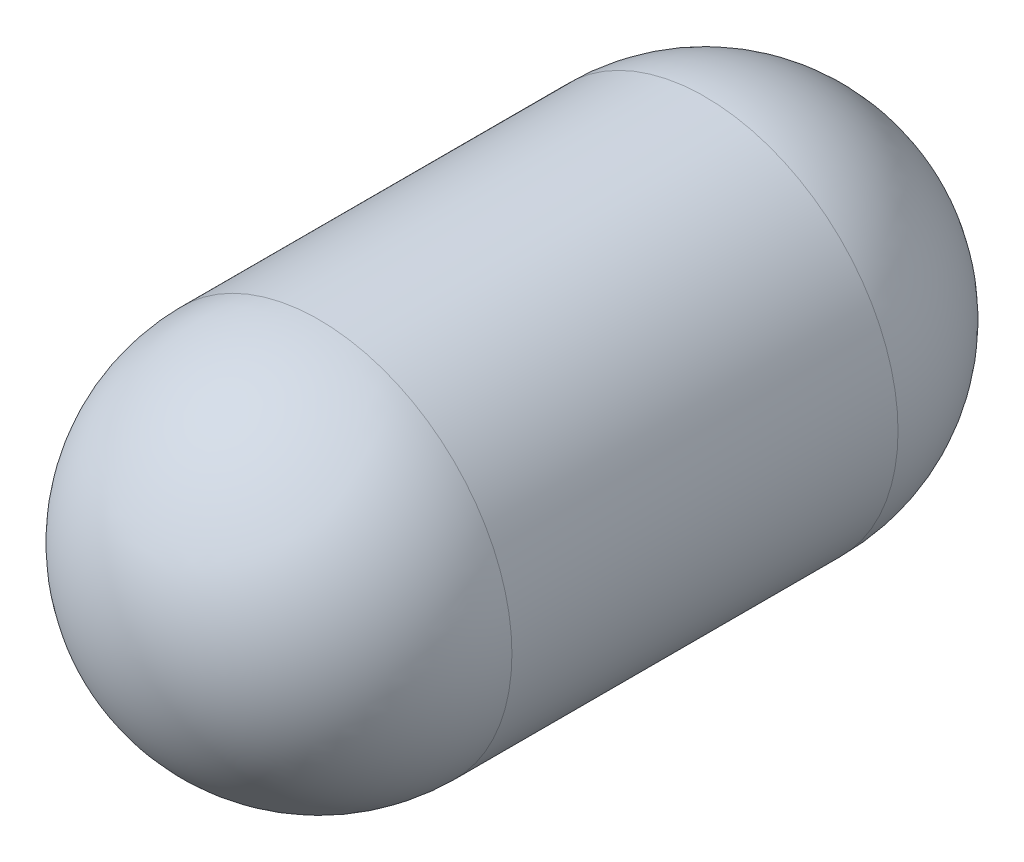
ISO-10303-21;
HEADER;
FILE_DESCRIPTION(('STEP AP214'),'2;1');
FILE_NAME('part.step','',(''),(''),'','','');
FILE_SCHEMA(('AUTOMOTIVE_DESIGN { 1 0 10303 214 1 1 1 1 }'));
ENDSEC;
DATA;
#1=APPLICATION_CONTEXT('core data for automotive mechanical design processes');
#2=APPLICATION_PROTOCOL_DEFINITION('international standard','automotive_design',2000,#1);
#3=PRODUCT_CONTEXT('',#1,'mechanical');
#4=PRODUCT('Part','Part','',(#3));
#5=PRODUCT_RELATED_PRODUCT_CATEGORY('part','',(#4));
#6=PRODUCT_DEFINITION_FORMATION('','',#4);
#7=PRODUCT_DEFINITION_CONTEXT('part definition',#1,'design');
#8=PRODUCT_DEFINITION('design','',#6,#7);
#9=PRODUCT_DEFINITION_SHAPE('','',#8);
#10=(LENGTH_UNIT() NAMED_UNIT(*) SI_UNIT(.MILLI.,.METRE.));
#11=(NAMED_UNIT(*) PLANE_ANGLE_UNIT() SI_UNIT($,.RADIAN.));
#12=(NAMED_UNIT(*) SI_UNIT($,.STERADIAN.) SOLID_ANGLE_UNIT());
#13=UNCERTAINTY_MEASURE_WITH_UNIT(LENGTH_MEASURE(1.E-05),#10,'distance_accuracy_value','');
#14=(GEOMETRIC_REPRESENTATION_CONTEXT(3) GLOBAL_UNCERTAINTY_ASSIGNED_CONTEXT((#13)) GLOBAL_UNIT_ASSIGNED_CONTEXT((#10,
#11,#12)) REPRESENTATION_CONTEXT('',''));
#15=CARTESIAN_POINT('',(0.,0.,0.));
#16=DIRECTION('',(0.,0.,1.));
#17=DIRECTION('',(1.,0.,0.));
#18=AXIS2_PLACEMENT_3D('',#15,#16,#17);
#19=CARTESIAN_POINT('',(0.,0.,-0.5));
#20=DIRECTION('',(0.,0.,1.));
#21=DIRECTION('',(1.,0.,0.));
#22=AXIS2_PLACEMENT_3D('',#19,#20,#21);
#23=CYLINDRICAL_SURFACE('',#22,0.5);
#24=CARTESIAN_POINT('',(0.,0.,-0.5));
#25=DIRECTION('',(0.,0.,1.));
#26=DIRECTION('',(1.,0.,0.));
#27=AXIS2_PLACEMENT_3D('',#24,#25,#26);
#28=CIRCLE('',#27,0.5);
#29=CARTESIAN_POINT('',(0.5,0.,-0.5));
#30=VERTEX_POINT('',#29);
#31=EDGE_CURVE('E10',#30,#30,#28,.T.);
#32=ORIENTED_EDGE('',*,*,#31,.T.);
#33=EDGE_LOOP('',(#32));
#34=FACE_BOUND('',#33,.T.);
#35=CARTESIAN_POINT('',(0.,0.,0.5));
#36=DIRECTION('',(0.,0.,1.));
#37=DIRECTION('',(1.,0.,0.));
#38=AXIS2_PLACEMENT_3D('',#35,#36,#37);
#39=CIRCLE('',#38,0.5);
#40=CARTESIAN_POINT('',(0.5,0.,0.5));
#41=VERTEX_POINT('',#40);
#42=EDGE_CURVE('E38',#41,#41,#39,.T.);
#43=ORIENTED_EDGE('',*,*,#42,.F.);
#44=EDGE_LOOP('',(#43));
#45=FACE_BOUND('',#44,.T.);
#46=ADVANCED_FACE('F31',(#34,#45),#23,.T.);
#47=CARTESIAN_POINT('',(0.,0.,-0.5));
#48=DIRECTION('',(0.,0.,1.));
#49=DIRECTION('',(1.,0.,0.));
#50=AXIS2_PLACEMENT_3D('',#47,#48,#49);
#51=SPHERICAL_SURFACE('',#50,0.5);
#52=ORIENTED_EDGE('',*,*,#31,.F.);
#53=EDGE_LOOP('',(#52));
#54=FACE_BOUND('',#53,.T.);
#55=ADVANCED_FACE('F33',(#54),#51,.T.);
#56=CARTESIAN_POINT('',(0.,0.,0.5));
#57=DIRECTION('',(0.,0.,1.));
#58=DIRECTION('',(1.,0.,0.));
#59=AXIS2_PLACEMENT_3D('',#56,#57,#58);
#60=SPHERICAL_SURFACE('',#59,0.5);
#61=ORIENTED_EDGE('',*,*,#42,.T.);
#62=EDGE_LOOP('',(#61));
#63=FACE_BOUND('',#62,.T.);
#64=ADVANCED_FACE('F44',(#63),#60,.T.);
#65=CLOSED_SHELL('',(#46,#55,#64));
#66=MANIFOLD_SOLID_BREP('B2',#65);
#67=ADVANCED_BREP_SHAPE_REPRESENTATION('',(#18,#66),#14);
#68=SHAPE_DEFINITION_REPRESENTATION(#9,#67);
ENDSEC;
END-ISO-10303-21;
